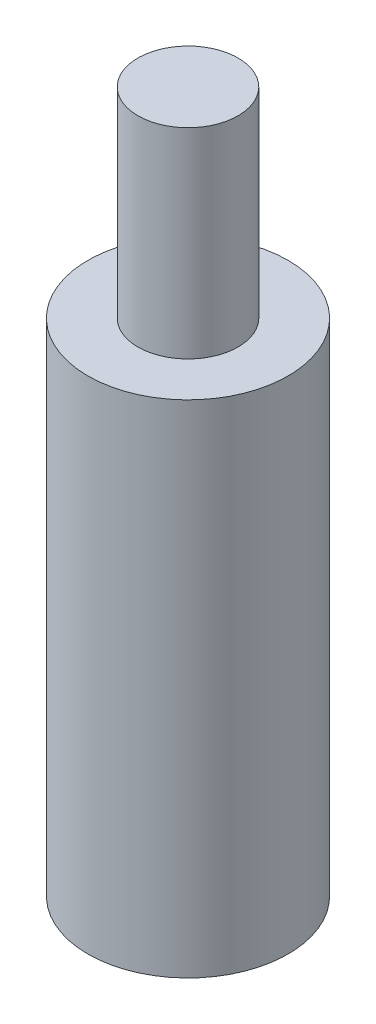
ISO-10303-21;
HEADER;
FILE_DESCRIPTION(('STEP AP214'),'2;1');
FILE_NAME('part.step','',(''),(''),'','','');
FILE_SCHEMA(('AUTOMOTIVE_DESIGN { 1 0 10303 214 1 1 1 1 }'));
ENDSEC;
DATA;
#1=APPLICATION_CONTEXT('core data for automotive mechanical design processes');
#2=APPLICATION_PROTOCOL_DEFINITION('international standard','automotive_design',2000,#1);
#3=PRODUCT_CONTEXT('',#1,'mechanical');
#4=PRODUCT('Part','Part','',(#3));
#5=PRODUCT_RELATED_PRODUCT_CATEGORY('part','',(#4));
#6=PRODUCT_DEFINITION_FORMATION('','',#4);
#7=PRODUCT_DEFINITION_CONTEXT('part definition',#1,'design');
#8=PRODUCT_DEFINITION('design','',#6,#7);
#9=PRODUCT_DEFINITION_SHAPE('','',#8);
#10=(LENGTH_UNIT() NAMED_UNIT(*) SI_UNIT(.MILLI.,.METRE.));
#11=(NAMED_UNIT(*) PLANE_ANGLE_UNIT() SI_UNIT($,.RADIAN.));
#12=(NAMED_UNIT(*) SI_UNIT($,.STERADIAN.) SOLID_ANGLE_UNIT());
#13=UNCERTAINTY_MEASURE_WITH_UNIT(LENGTH_MEASURE(1.E-05),#10,'distance_accuracy_value','');
#14=(GEOMETRIC_REPRESENTATION_CONTEXT(3) GLOBAL_UNCERTAINTY_ASSIGNED_CONTEXT((#13)) GLOBAL_UNIT_ASSIGNED_CONTEXT((#10,
#11,#12)) REPRESENTATION_CONTEXT('',''));
#15=CARTESIAN_POINT('',(0.,0.,0.));
#16=DIRECTION('',(0.,0.,1.));
#17=DIRECTION('',(1.,0.,0.));
#18=AXIS2_PLACEMENT_3D('',#15,#16,#17);
#19=CARTESIAN_POINT('',(0.,14.,0.));
#20=DIRECTION('',(0.,-1.,0.));
#21=DIRECTION('',(0.,0.,-1.));
#22=AXIS2_PLACEMENT_3D('',#19,#20,#21);
#23=CYLINDRICAL_SURFACE('',#22,1.);
#24=CARTESIAN_POINT('',(0.,14.,0.));
#25=DIRECTION('',(0.,1.,0.));
#26=DIRECTION('',(0.,0.,1.));
#27=AXIS2_PLACEMENT_3D('',#24,#25,#26);
#28=CIRCLE('',#27,1.);
#29=CARTESIAN_POINT('',(0.,14.,1.));
#30=VERTEX_POINT('',#29);
#31=EDGE_CURVE('E11',#30,#30,#28,.T.);
#32=ORIENTED_EDGE('',*,*,#31,.F.);
#33=EDGE_LOOP('',(#32));
#34=FACE_BOUND('',#33,.T.);
#35=CARTESIAN_POINT('',(0.,10.,0.));
#36=DIRECTION('',(0.,1.,0.));
#37=DIRECTION('',(0.,0.,1.));
#38=AXIS2_PLACEMENT_3D('',#35,#36,#37);
#39=CIRCLE('',#38,1.);
#40=CARTESIAN_POINT('',(0.,10.,1.));
#41=VERTEX_POINT('',#40);
#42=EDGE_CURVE('E42',#41,#41,#39,.T.);
#43=ORIENTED_EDGE('',*,*,#42,.T.);
#44=EDGE_LOOP('',(#43));
#45=FACE_BOUND('',#44,.T.);
#46=ADVANCED_FACE('F39',(#34,#45),#23,.T.);
#47=CARTESIAN_POINT('',(0.,14.,0.));
#48=DIRECTION('',(0.,1.,0.));
#49=DIRECTION('',(0.,0.,1.));
#50=AXIS2_PLACEMENT_3D('',#47,#48,#49);
#51=PLANE('',#50);
#52=ORIENTED_EDGE('',*,*,#31,.T.);
#53=EDGE_LOOP('',(#52));
#54=FACE_BOUND('',#53,.T.);
#55=ADVANCED_FACE('F54',(#54),#51,.T.);
#56=CARTESIAN_POINT('',(0.,10.,0.));
#57=DIRECTION('',(0.,1.,0.));
#58=DIRECTION('',(0.,0.,1.));
#59=AXIS2_PLACEMENT_3D('',#56,#57,#58);
#60=PLANE('',#59);
#61=ORIENTED_EDGE('',*,*,#42,.F.);
#62=EDGE_LOOP('',(#61));
#63=FACE_BOUND('',#62,.T.);
#64=ADVANCED_FACE('F52',(#63),#60,.F.);
#65=CLOSED_SHELL('',(#46,#55,#64));
#66=MANIFOLD_SOLID_BREP('B2',#65);
#67=CARTESIAN_POINT('',(0.,10.,0.));
#68=DIRECTION('',(0.,1.,0.));
#69=DIRECTION('',(0.,0.,1.));
#70=AXIS2_PLACEMENT_3D('',#67,#68,#69);
#71=PLANE('',#70);
#72=CARTESIAN_POINT('',(0.,10.,0.));
#73=DIRECTION('',(0.,1.,0.));
#74=DIRECTION('',(0.,0.,1.));
#75=AXIS2_PLACEMENT_3D('',#72,#73,#74);
#76=CIRCLE('',#75,2.);
#77=CARTESIAN_POINT('',(0.,10.,2.));
#78=VERTEX_POINT('',#77);
#79=EDGE_CURVE('E38',#78,#78,#76,.T.);
#80=ORIENTED_EDGE('',*,*,#79,.T.);
#81=EDGE_LOOP('',(#80));
#82=FACE_BOUND('',#81,.T.);
#83=CARTESIAN_POINT('',(0.,10.,0.));
#84=DIRECTION('',(0.,1.,0.));
#85=DIRECTION('',(0.,0.,1.));
#86=AXIS2_PLACEMENT_3D('',#83,#84,#85);
#87=CIRCLE('',#86,1.);
#88=CARTESIAN_POINT('',(0.,10.,1.));
#89=VERTEX_POINT('',#88);
#90=EDGE_CURVE('E91',#89,#89,#87,.T.);
#91=ORIENTED_EDGE('',*,*,#90,.F.);
#92=EDGE_LOOP('',(#91));
#93=FACE_BOUND('',#92,.T.);
#94=ADVANCED_FACE('F80',(#82,#93),#71,.T.);
#95=CARTESIAN_POINT('',(0.,0.,0.));
#96=DIRECTION('',(0.,1.,0.));
#97=DIRECTION('',(0.,0.,1.));
#98=AXIS2_PLACEMENT_3D('',#95,#96,#97);
#99=PLANE('',#98);
#100=CARTESIAN_POINT('',(0.,0.,0.));
#101=DIRECTION('',(0.,1.,0.));
#102=DIRECTION('',(0.,0.,1.));
#103=AXIS2_PLACEMENT_3D('',#100,#101,#102);
#104=CIRCLE('',#103,2.);
#105=CARTESIAN_POINT('',(0.,0.,2.));
#106=VERTEX_POINT('',#105);
#107=EDGE_CURVE('E84',#106,#106,#104,.T.);
#108=ORIENTED_EDGE('',*,*,#107,.F.);
#109=EDGE_LOOP('',(#108));
#110=FACE_BOUND('',#109,.T.);
#111=CARTESIAN_POINT('',(0.,0.,0.));
#112=DIRECTION('',(0.,1.,0.));
#113=DIRECTION('',(0.,0.,1.));
#114=AXIS2_PLACEMENT_3D('',#111,#112,#113);
#115=CIRCLE('',#114,1.);
#116=CARTESIAN_POINT('',(0.,0.,1.));
#117=VERTEX_POINT('',#116);
#118=EDGE_CURVE('E93',#117,#117,#115,.T.);
#119=ORIENTED_EDGE('',*,*,#118,.T.);
#120=EDGE_LOOP('',(#119));
#121=FACE_BOUND('',#120,.T.);
#122=ADVANCED_FACE('F103',(#110,#121),#99,.F.);
#123=CARTESIAN_POINT('',(0.,10.,0.));
#124=DIRECTION('',(0.,-1.,0.));
#125=DIRECTION('',(0.,0.,-1.));
#126=AXIS2_PLACEMENT_3D('',#123,#124,#125);
#127=CYLINDRICAL_SURFACE('',#126,2.);
#128=ORIENTED_EDGE('',*,*,#79,.F.);
#129=EDGE_LOOP('',(#128));
#130=FACE_BOUND('',#129,.T.);
#131=ORIENTED_EDGE('',*,*,#107,.T.);
#132=EDGE_LOOP('',(#131));
#133=FACE_BOUND('',#132,.T.);
#134=ADVANCED_FACE('F82',(#130,#133),#127,.T.);
#135=CARTESIAN_POINT('',(0.,10.,0.));
#136=DIRECTION('',(0.,-1.,0.));
#137=DIRECTION('',(0.,0.,-1.));
#138=AXIS2_PLACEMENT_3D('',#135,#136,#137);
#139=CYLINDRICAL_SURFACE('',#138,1.);
#140=ORIENTED_EDGE('',*,*,#90,.T.);
#141=EDGE_LOOP('',(#140));
#142=FACE_BOUND('',#141,.T.);
#143=ORIENTED_EDGE('',*,*,#118,.F.);
#144=EDGE_LOOP('',(#143));
#145=FACE_BOUND('',#144,.T.);
#146=ADVANCED_FACE('F99',(#142,#145),#139,.F.);
#147=CLOSED_SHELL('',(#94,#122,#134,#146));
#148=MANIFOLD_SOLID_BREP('B6',#147);
#149=ADVANCED_BREP_SHAPE_REPRESENTATION('',(#18,#66,#148),#14);
#150=SHAPE_DEFINITION_REPRESENTATION(#9,#149);
ENDSEC;
END-ISO-10303-21;
